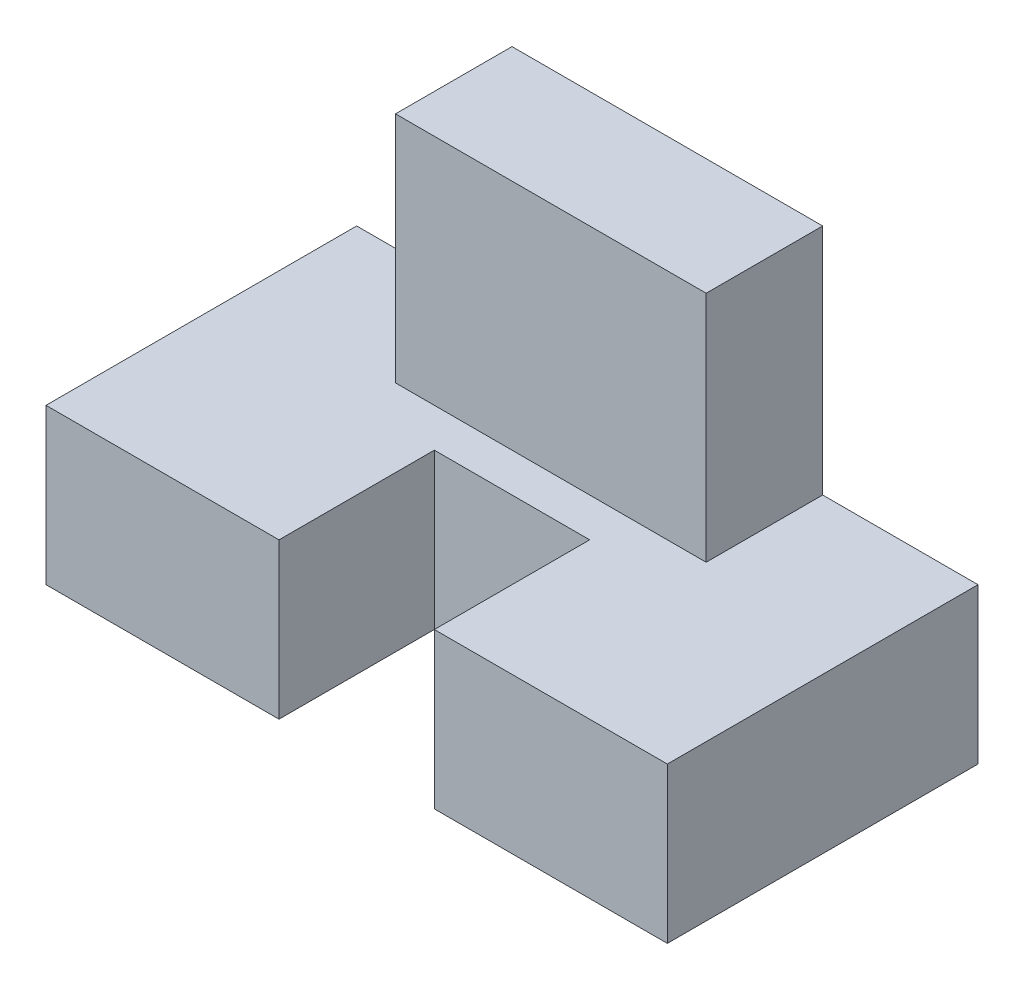
ISO-10303-21;
HEADER;
FILE_DESCRIPTION(('STEP AP214'),'2;1');
FILE_NAME('part.step','',(''),(''),'','','');
FILE_SCHEMA(('AUTOMOTIVE_DESIGN { 1 0 10303 214 1 1 1 1 }'));
ENDSEC;
DATA;
#1=APPLICATION_CONTEXT('core data for automotive mechanical design processes');
#2=APPLICATION_PROTOCOL_DEFINITION('international standard','automotive_design',2000,#1);
#3=PRODUCT_CONTEXT('',#1,'mechanical');
#4=PRODUCT('Part','Part','',(#3));
#5=PRODUCT_RELATED_PRODUCT_CATEGORY('part','',(#4));
#6=PRODUCT_DEFINITION_FORMATION('','',#4);
#7=PRODUCT_DEFINITION_CONTEXT('part definition',#1,'design');
#8=PRODUCT_DEFINITION('design','',#6,#7);
#9=PRODUCT_DEFINITION_SHAPE('','',#8);
#10=(LENGTH_UNIT() NAMED_UNIT(*) SI_UNIT(.MILLI.,.METRE.));
#11=(NAMED_UNIT(*) PLANE_ANGLE_UNIT() SI_UNIT($,.RADIAN.));
#12=(NAMED_UNIT(*) SI_UNIT($,.STERADIAN.) SOLID_ANGLE_UNIT());
#13=UNCERTAINTY_MEASURE_WITH_UNIT(LENGTH_MEASURE(1.E-05),#10,'distance_accuracy_value','');
#14=(GEOMETRIC_REPRESENTATION_CONTEXT(3) GLOBAL_UNCERTAINTY_ASSIGNED_CONTEXT((#13)) GLOBAL_UNIT_ASSIGNED_CONTEXT((#10,
#11,#12)) REPRESENTATION_CONTEXT('',''));
#15=CARTESIAN_POINT('',(0.,0.,0.));
#16=DIRECTION('',(0.,0.,1.));
#17=DIRECTION('',(1.,0.,0.));
#18=AXIS2_PLACEMENT_3D('',#15,#16,#17);
#19=CARTESIAN_POINT('',(0.,25.4,0.));
#20=DIRECTION('',(0.,-1.,0.));
#21=DIRECTION('',(0.,0.,-1.));
#22=AXIS2_PLACEMENT_3D('',#19,#20,#21);
#23=PLANE('',#22);
#24=DIRECTION('',(0.,0.,-1.));
#25=VECTOR('',#24,1.);
#26=CARTESIAN_POINT('',(76.2,25.4,-31.75));
#27=LINE('',#26,#25);
#28=CARTESIAN_POINT('',(76.2,25.4,-31.75));
#29=VERTEX_POINT('',#28);
#30=CARTESIAN_POINT('',(76.2,25.4,-50.8));
#31=VERTEX_POINT('',#30);
#32=EDGE_CURVE('E48',#29,#31,#27,.T.);
#33=ORIENTED_EDGE('',*,*,#32,.F.);
#34=DIRECTION('',(1.,0.,0.));
#35=VECTOR('',#34,1.);
#36=CARTESIAN_POINT('',(25.4,25.4,-31.75));
#37=LINE('',#36,#35);
#38=CARTESIAN_POINT('',(25.4,25.4,-31.75));
#39=VERTEX_POINT('',#38);
#40=EDGE_CURVE('E357',#39,#29,#37,.T.);
#41=ORIENTED_EDGE('',*,*,#40,.F.);
#42=DIRECTION('',(0.,0.,1.));
#43=VECTOR('',#42,1.);
#44=CARTESIAN_POINT('',(25.4,25.4,-50.8));
#45=LINE('',#44,#43);
#46=CARTESIAN_POINT('',(25.4,25.4,-50.8));
#47=VERTEX_POINT('',#46);
#48=EDGE_CURVE('E54',#47,#39,#45,.T.);
#49=ORIENTED_EDGE('',*,*,#48,.F.);
#50=DIRECTION('',(-1.,0.,0.));
#51=VECTOR('',#50,1.);
#52=CARTESIAN_POINT('',(0.,25.4,-50.8));
#53=LINE('',#52,#51);
#54=CARTESIAN_POINT('',(0.,25.4,-50.8));
#55=VERTEX_POINT('',#54);
#56=EDGE_CURVE('E143',#47,#55,#53,.T.);
#57=ORIENTED_EDGE('',*,*,#56,.T.);
#58=DIRECTION('',(0.,0.,1.));
#59=VECTOR('',#58,1.);
#60=CARTESIAN_POINT('',(0.,25.4,0.));
#61=LINE('',#60,#59);
#62=CARTESIAN_POINT('',(0.,25.4,0.));
#63=VERTEX_POINT('',#62);
#64=EDGE_CURVE('E153',#55,#63,#61,.T.);
#65=ORIENTED_EDGE('',*,*,#64,.T.);
#66=DIRECTION('',(1.,0.,0.));
#67=VECTOR('',#66,1.);
#68=CARTESIAN_POINT('',(0.,25.4,0.));
#69=LINE('',#68,#67);
#70=CARTESIAN_POINT('',(38.1,25.4,0.));
#71=VERTEX_POINT('',#70);
#72=EDGE_CURVE('E156',#63,#71,#69,.T.);
#73=ORIENTED_EDGE('',*,*,#72,.T.);
#74=DIRECTION('',(0.,0.,-1.));
#75=VECTOR('',#74,1.);
#76=CARTESIAN_POINT('',(38.1,25.4,0.));
#77=LINE('',#76,#75);
#78=CARTESIAN_POINT('',(38.1,25.4,-25.4));
#79=VERTEX_POINT('',#78);
#80=EDGE_CURVE('E159',#71,#79,#77,.T.);
#81=ORIENTED_EDGE('',*,*,#80,.T.);
#82=DIRECTION('',(1.,0.,0.));
#83=VECTOR('',#82,1.);
#84=CARTESIAN_POINT('',(38.1,25.4,-25.4));
#85=LINE('',#84,#83);
#86=CARTESIAN_POINT('',(63.5,25.4,-25.4));
#87=VERTEX_POINT('',#86);
#88=EDGE_CURVE('E161',#79,#87,#85,.T.);
#89=ORIENTED_EDGE('',*,*,#88,.T.);
#90=DIRECTION('',(0.,0.,1.));
#91=VECTOR('',#90,1.);
#92=CARTESIAN_POINT('',(63.5,25.4,-25.4));
#93=LINE('',#92,#91);
#94=CARTESIAN_POINT('',(63.5,25.4,0.));
#95=VERTEX_POINT('',#94);
#96=EDGE_CURVE('E163',#87,#95,#93,.T.);
#97=ORIENTED_EDGE('',*,*,#96,.T.);
#98=DIRECTION('',(1.,0.,0.));
#99=VECTOR('',#98,1.);
#100=CARTESIAN_POINT('',(63.5,25.4,0.));
#101=LINE('',#100,#99);
#102=CARTESIAN_POINT('',(101.6,25.4,0.));
#103=VERTEX_POINT('',#102);
#104=EDGE_CURVE('E165',#95,#103,#101,.T.);
#105=ORIENTED_EDGE('',*,*,#104,.T.);
#106=DIRECTION('',(0.,0.,-1.));
#107=VECTOR('',#106,1.);
#108=CARTESIAN_POINT('',(101.6,25.4,0.));
#109=LINE('',#108,#107);
#110=CARTESIAN_POINT('',(101.6,25.4,-50.8));
#111=VERTEX_POINT('',#110);
#112=EDGE_CURVE('E167',#103,#111,#109,.T.);
#113=ORIENTED_EDGE('',*,*,#112,.T.);
#114=EDGE_CURVE('E169',#111,#31,#53,.T.);
#115=ORIENTED_EDGE('',*,*,#114,.T.);
#116=EDGE_LOOP('',(#33,#41,#49,#57,#65,#73,#81,#89,#97,#105,#113,#115));
#117=FACE_BOUND('',#116,.T.);
#118=ADVANCED_FACE('F33',(#117),#23,.F.);
#119=CARTESIAN_POINT('',(0.,25.4,0.));
#120=DIRECTION('',(1.,0.,0.));
#121=DIRECTION('',(0.,0.,-1.));
#122=AXIS2_PLACEMENT_3D('',#119,#120,#121);
#123=PLANE('',#122);
#124=DIRECTION('',(0.,0.,1.));
#125=VECTOR('',#124,1.);
#126=CARTESIAN_POINT('',(0.,0.,0.));
#127=LINE('',#126,#125);
#128=CARTESIAN_POINT('',(0.,0.,-50.8));
#129=VERTEX_POINT('',#128);
#130=CARTESIAN_POINT('',(0.,0.,0.));
#131=VERTEX_POINT('',#130);
#132=EDGE_CURVE('E144',#129,#131,#127,.T.);
#133=ORIENTED_EDGE('',*,*,#132,.T.);
#134=DIRECTION('',(0.,-1.,0.));
#135=VECTOR('',#134,1.);
#136=CARTESIAN_POINT('',(0.,25.4,0.));
#137=LINE('',#136,#135);
#138=EDGE_CURVE('E11',#63,#131,#137,.T.);
#139=ORIENTED_EDGE('',*,*,#138,.F.);
#140=ORIENTED_EDGE('',*,*,#64,.F.);
#141=DIRECTION('',(0.,-1.,0.));
#142=VECTOR('',#141,1.);
#143=CARTESIAN_POINT('',(0.,25.4,-50.8));
#144=LINE('',#143,#142);
#145=EDGE_CURVE('E170',#55,#129,#144,.T.);
#146=ORIENTED_EDGE('',*,*,#145,.T.);
#147=EDGE_LOOP('',(#133,#139,#140,#146));
#148=FACE_BOUND('',#147,.T.);
#149=ADVANCED_FACE('F35',(#148),#123,.F.);
#150=CARTESIAN_POINT('',(0.,25.4,0.));
#151=DIRECTION('',(0.,0.,-1.));
#152=DIRECTION('',(-1.,0.,0.));
#153=AXIS2_PLACEMENT_3D('',#150,#151,#152);
#154=PLANE('',#153);
#155=DIRECTION('',(1.,0.,0.));
#156=VECTOR('',#155,1.);
#157=CARTESIAN_POINT('',(0.,0.,0.));
#158=LINE('',#157,#156);
#159=CARTESIAN_POINT('',(38.1,0.,0.));
#160=VERTEX_POINT('',#159);
#161=EDGE_CURVE('E147',#131,#160,#158,.T.);
#162=ORIENTED_EDGE('',*,*,#161,.T.);
#163=DIRECTION('',(0.,-1.,0.));
#164=VECTOR('',#163,1.);
#165=CARTESIAN_POINT('',(38.1,25.4,0.));
#166=LINE('',#165,#164);
#167=EDGE_CURVE('E41',#71,#160,#166,.T.);
#168=ORIENTED_EDGE('',*,*,#167,.F.);
#169=ORIENTED_EDGE('',*,*,#72,.F.);
#170=ORIENTED_EDGE('',*,*,#138,.T.);
#171=EDGE_LOOP('',(#162,#168,#169,#170));
#172=FACE_BOUND('',#171,.T.);
#173=ADVANCED_FACE('F226',(#172),#154,.F.);
#174=CARTESIAN_POINT('',(38.1,25.4,0.));
#175=DIRECTION('',(-1.,0.,0.));
#176=DIRECTION('',(0.,0.,1.));
#177=AXIS2_PLACEMENT_3D('',#174,#175,#176);
#178=PLANE('',#177);
#179=DIRECTION('',(0.,0.,-1.));
#180=VECTOR('',#179,1.);
#181=CARTESIAN_POINT('',(38.1,0.,0.));
#182=LINE('',#181,#180);
#183=CARTESIAN_POINT('',(38.1,0.,-25.4));
#184=VERTEX_POINT('',#183);
#185=EDGE_CURVE('E173',#160,#184,#182,.T.);
#186=ORIENTED_EDGE('',*,*,#185,.T.);
#187=DIRECTION('',(0.,-1.,0.));
#188=VECTOR('',#187,1.);
#189=CARTESIAN_POINT('',(38.1,25.4,-25.4));
#190=LINE('',#189,#188);
#191=EDGE_CURVE('E198',#79,#184,#190,.T.);
#192=ORIENTED_EDGE('',*,*,#191,.F.);
#193=ORIENTED_EDGE('',*,*,#80,.F.);
#194=ORIENTED_EDGE('',*,*,#167,.T.);
#195=EDGE_LOOP('',(#186,#192,#193,#194));
#196=FACE_BOUND('',#195,.T.);
#197=ADVANCED_FACE('F205',(#196),#178,.F.);
#198=CARTESIAN_POINT('',(38.1,25.4,-25.4));
#199=DIRECTION('',(0.,0.,-1.));
#200=DIRECTION('',(-1.,0.,0.));
#201=AXIS2_PLACEMENT_3D('',#198,#199,#200);
#202=PLANE('',#201);
#203=DIRECTION('',(1.,0.,0.));
#204=VECTOR('',#203,1.);
#205=CARTESIAN_POINT('',(38.1,0.,-25.4));
#206=LINE('',#205,#204);
#207=CARTESIAN_POINT('',(63.5,0.,-25.4));
#208=VERTEX_POINT('',#207);
#209=EDGE_CURVE('E175',#184,#208,#206,.T.);
#210=ORIENTED_EDGE('',*,*,#209,.T.);
#211=DIRECTION('',(0.,-1.,0.));
#212=VECTOR('',#211,1.);
#213=CARTESIAN_POINT('',(63.5,25.4,-25.4));
#214=LINE('',#213,#212);
#215=EDGE_CURVE('E195',#87,#208,#214,.T.);
#216=ORIENTED_EDGE('',*,*,#215,.F.);
#217=ORIENTED_EDGE('',*,*,#88,.F.);
#218=ORIENTED_EDGE('',*,*,#191,.T.);
#219=EDGE_LOOP('',(#210,#216,#217,#218));
#220=FACE_BOUND('',#219,.T.);
#221=ADVANCED_FACE('F216',(#220),#202,.F.);
#222=CARTESIAN_POINT('',(63.5,25.4,-25.4));
#223=DIRECTION('',(1.,0.,0.));
#224=DIRECTION('',(0.,0.,-1.));
#225=AXIS2_PLACEMENT_3D('',#222,#223,#224);
#226=PLANE('',#225);
#227=DIRECTION('',(0.,0.,1.));
#228=VECTOR('',#227,1.);
#229=CARTESIAN_POINT('',(63.5,0.,-25.4));
#230=LINE('',#229,#228);
#231=CARTESIAN_POINT('',(63.5,0.,0.));
#232=VERTEX_POINT('',#231);
#233=EDGE_CURVE('E177',#208,#232,#230,.T.);
#234=ORIENTED_EDGE('',*,*,#233,.T.);
#235=DIRECTION('',(0.,-1.,0.));
#236=VECTOR('',#235,1.);
#237=CARTESIAN_POINT('',(63.5,25.4,0.));
#238=LINE('',#237,#236);
#239=EDGE_CURVE('E192',#95,#232,#238,.T.);
#240=ORIENTED_EDGE('',*,*,#239,.F.);
#241=ORIENTED_EDGE('',*,*,#96,.F.);
#242=ORIENTED_EDGE('',*,*,#215,.T.);
#243=EDGE_LOOP('',(#234,#240,#241,#242));
#244=FACE_BOUND('',#243,.T.);
#245=ADVANCED_FACE('F220',(#244),#226,.F.);
#246=CARTESIAN_POINT('',(63.5,25.4,0.));
#247=DIRECTION('',(0.,0.,-1.));
#248=DIRECTION('',(-1.,0.,0.));
#249=AXIS2_PLACEMENT_3D('',#246,#247,#248);
#250=PLANE('',#249);
#251=DIRECTION('',(1.,0.,0.));
#252=VECTOR('',#251,1.);
#253=CARTESIAN_POINT('',(63.5,0.,0.));
#254=LINE('',#253,#252);
#255=CARTESIAN_POINT('',(101.6,0.,0.));
#256=VERTEX_POINT('',#255);
#257=EDGE_CURVE('E179',#232,#256,#254,.T.);
#258=ORIENTED_EDGE('',*,*,#257,.T.);
#259=DIRECTION('',(0.,-1.,0.));
#260=VECTOR('',#259,1.);
#261=CARTESIAN_POINT('',(101.6,25.4,0.));
#262=LINE('',#261,#260);
#263=EDGE_CURVE('E189',#103,#256,#262,.T.);
#264=ORIENTED_EDGE('',*,*,#263,.F.);
#265=ORIENTED_EDGE('',*,*,#104,.F.);
#266=ORIENTED_EDGE('',*,*,#239,.T.);
#267=EDGE_LOOP('',(#258,#264,#265,#266));
#268=FACE_BOUND('',#267,.T.);
#269=ADVANCED_FACE('F236',(#268),#250,.F.);
#270=CARTESIAN_POINT('',(101.6,25.4,0.));
#271=DIRECTION('',(-1.,0.,0.));
#272=DIRECTION('',(0.,0.,1.));
#273=AXIS2_PLACEMENT_3D('',#270,#271,#272);
#274=PLANE('',#273);
#275=DIRECTION('',(0.,0.,-1.));
#276=VECTOR('',#275,1.);
#277=CARTESIAN_POINT('',(101.6,0.,0.));
#278=LINE('',#277,#276);
#279=CARTESIAN_POINT('',(101.6,0.,-50.8));
#280=VERTEX_POINT('',#279);
#281=EDGE_CURVE('E181',#256,#280,#278,.T.);
#282=ORIENTED_EDGE('',*,*,#281,.T.);
#283=DIRECTION('',(0.,-1.,0.));
#284=VECTOR('',#283,1.);
#285=CARTESIAN_POINT('',(101.6,25.4,-50.8));
#286=LINE('',#285,#284);
#287=EDGE_CURVE('E186',#111,#280,#286,.T.);
#288=ORIENTED_EDGE('',*,*,#287,.F.);
#289=ORIENTED_EDGE('',*,*,#112,.F.);
#290=ORIENTED_EDGE('',*,*,#263,.T.);
#291=EDGE_LOOP('',(#282,#288,#289,#290));
#292=FACE_BOUND('',#291,.T.);
#293=ADVANCED_FACE('F234',(#292),#274,.F.);
#294=CARTESIAN_POINT('',(0.,25.4,-50.8));
#295=DIRECTION('',(0.,0.,1.));
#296=DIRECTION('',(1.,0.,0.));
#297=AXIS2_PLACEMENT_3D('',#294,#295,#296);
#298=PLANE('',#297);
#299=DIRECTION('',(-1.,0.,0.));
#300=VECTOR('',#299,1.);
#301=CARTESIAN_POINT('',(0.,0.,-50.8));
#302=LINE('',#301,#300);
#303=EDGE_CURVE('E157',#280,#129,#302,.T.);
#304=ORIENTED_EDGE('',*,*,#303,.T.);
#305=ORIENTED_EDGE('',*,*,#145,.F.);
#306=ORIENTED_EDGE('',*,*,#56,.F.);
#307=DIRECTION('',(0.,-1.,0.));
#308=VECTOR('',#307,1.);
#309=CARTESIAN_POINT('',(25.4,63.5,-50.8));
#310=LINE('',#309,#308);
#311=CARTESIAN_POINT('',(25.4,63.5,-50.8));
#312=VERTEX_POINT('',#311);
#313=EDGE_CURVE('E125',#312,#47,#310,.T.);
#314=ORIENTED_EDGE('',*,*,#313,.F.);
#315=DIRECTION('',(-1.,0.,0.));
#316=VECTOR('',#315,1.);
#317=CARTESIAN_POINT('',(76.2,63.5,-50.8));
#318=LINE('',#317,#316);
#319=CARTESIAN_POINT('',(76.2,63.5,-50.8));
#320=VERTEX_POINT('',#319);
#321=EDGE_CURVE('E131',#320,#312,#318,.T.);
#322=ORIENTED_EDGE('',*,*,#321,.F.);
#323=DIRECTION('',(0.,-1.,0.));
#324=VECTOR('',#323,1.);
#325=CARTESIAN_POINT('',(76.2,63.5,-50.8));
#326=LINE('',#325,#324);
#327=EDGE_CURVE('E355',#320,#31,#326,.T.);
#328=ORIENTED_EDGE('',*,*,#327,.T.);
#329=ORIENTED_EDGE('',*,*,#114,.F.);
#330=ORIENTED_EDGE('',*,*,#287,.T.);
#331=EDGE_LOOP('',(#304,#305,#306,#314,#322,#328,#329,#330));
#332=FACE_BOUND('',#331,.T.);
#333=ADVANCED_FACE('F141',(#332),#298,.F.);
#334=CARTESIAN_POINT('',(0.,0.,0.));
#335=DIRECTION('',(0.,-1.,0.));
#336=DIRECTION('',(0.,0.,-1.));
#337=AXIS2_PLACEMENT_3D('',#334,#335,#336);
#338=PLANE('',#337);
#339=ORIENTED_EDGE('',*,*,#132,.F.);
#340=ORIENTED_EDGE('',*,*,#303,.F.);
#341=ORIENTED_EDGE('',*,*,#281,.F.);
#342=ORIENTED_EDGE('',*,*,#257,.F.);
#343=ORIENTED_EDGE('',*,*,#233,.F.);
#344=ORIENTED_EDGE('',*,*,#209,.F.);
#345=ORIENTED_EDGE('',*,*,#185,.F.);
#346=ORIENTED_EDGE('',*,*,#161,.F.);
#347=EDGE_LOOP('',(#339,#340,#341,#342,#343,#344,#345,#346));
#348=FACE_BOUND('',#347,.T.);
#349=ADVANCED_FACE('F211',(#348),#338,.T.);
#350=CARTESIAN_POINT('',(25.4,63.5,-50.8));
#351=DIRECTION('',(1.,0.,0.));
#352=DIRECTION('',(0.,0.,-1.));
#353=AXIS2_PLACEMENT_3D('',#350,#351,#352);
#354=PLANE('',#353);
#355=ORIENTED_EDGE('',*,*,#48,.T.);
#356=DIRECTION('',(0.,-1.,0.));
#357=VECTOR('',#356,1.);
#358=CARTESIAN_POINT('',(25.4,63.5,-31.75));
#359=LINE('',#358,#357);
#360=CARTESIAN_POINT('',(25.4,63.5,-31.75));
#361=VERTEX_POINT('',#360);
#362=EDGE_CURVE('E127',#361,#39,#359,.T.);
#363=ORIENTED_EDGE('',*,*,#362,.F.);
#364=DIRECTION('',(0.,0.,1.));
#365=VECTOR('',#364,1.);
#366=CARTESIAN_POINT('',(25.4,63.5,-50.8));
#367=LINE('',#366,#365);
#368=EDGE_CURVE('E121',#312,#361,#367,.T.);
#369=ORIENTED_EDGE('',*,*,#368,.F.);
#370=ORIENTED_EDGE('',*,*,#313,.T.);
#371=EDGE_LOOP('',(#355,#363,#369,#370));
#372=FACE_BOUND('',#371,.T.);
#373=ADVANCED_FACE('F123',(#372),#354,.F.);
#374=CARTESIAN_POINT('',(25.4,63.5,-31.75));
#375=DIRECTION('',(0.,0.,-1.));
#376=DIRECTION('',(-1.,0.,0.));
#377=AXIS2_PLACEMENT_3D('',#374,#375,#376);
#378=PLANE('',#377);
#379=ORIENTED_EDGE('',*,*,#40,.T.);
#380=DIRECTION('',(0.,-1.,0.));
#381=VECTOR('',#380,1.);
#382=CARTESIAN_POINT('',(76.2,63.5,-31.75));
#383=LINE('',#382,#381);
#384=CARTESIAN_POINT('',(76.2,63.5,-31.75));
#385=VERTEX_POINT('',#384);
#386=EDGE_CURVE('E149',#385,#29,#383,.T.);
#387=ORIENTED_EDGE('',*,*,#386,.F.);
#388=DIRECTION('',(1.,0.,0.));
#389=VECTOR('',#388,1.);
#390=CARTESIAN_POINT('',(25.4,63.5,-31.75));
#391=LINE('',#390,#389);
#392=EDGE_CURVE('E130',#361,#385,#391,.T.);
#393=ORIENTED_EDGE('',*,*,#392,.F.);
#394=ORIENTED_EDGE('',*,*,#362,.T.);
#395=EDGE_LOOP('',(#379,#387,#393,#394));
#396=FACE_BOUND('',#395,.T.);
#397=ADVANCED_FACE('F270',(#396),#378,.F.);
#398=CARTESIAN_POINT('',(76.2,63.5,-31.75));
#399=DIRECTION('',(-1.,0.,0.));
#400=DIRECTION('',(0.,0.,1.));
#401=AXIS2_PLACEMENT_3D('',#398,#399,#400);
#402=PLANE('',#401);
#403=ORIENTED_EDGE('',*,*,#32,.T.);
#404=ORIENTED_EDGE('',*,*,#327,.F.);
#405=DIRECTION('',(0.,0.,-1.));
#406=VECTOR('',#405,1.);
#407=CARTESIAN_POINT('',(76.2,63.5,-31.75));
#408=LINE('',#407,#406);
#409=EDGE_CURVE('E136',#385,#320,#408,.T.);
#410=ORIENTED_EDGE('',*,*,#409,.F.);
#411=ORIENTED_EDGE('',*,*,#386,.T.);
#412=EDGE_LOOP('',(#403,#404,#410,#411));
#413=FACE_BOUND('',#412,.T.);
#414=ADVANCED_FACE('F276',(#413),#402,.F.);
#415=CARTESIAN_POINT('',(0.,63.5,0.));
#416=DIRECTION('',(0.,1.,0.));
#417=DIRECTION('',(0.,0.,1.));
#418=AXIS2_PLACEMENT_3D('',#415,#416,#417);
#419=PLANE('',#418);
#420=ORIENTED_EDGE('',*,*,#321,.T.);
#421=ORIENTED_EDGE('',*,*,#368,.T.);
#422=ORIENTED_EDGE('',*,*,#392,.T.);
#423=ORIENTED_EDGE('',*,*,#409,.T.);
#424=EDGE_LOOP('',(#420,#421,#422,#423));
#425=FACE_BOUND('',#424,.T.);
#426=ADVANCED_FACE('F134',(#425),#419,.T.);
#427=CLOSED_SHELL('',(#118,#149,#173,#197,#221,#245,#269,#293,#333,#349,#373,#397,#414,#426));
#428=MANIFOLD_SOLID_BREP('B2',#427);
#429=ADVANCED_BREP_SHAPE_REPRESENTATION('',(#18,#428),#14);
#430=SHAPE_DEFINITION_REPRESENTATION(#9,#429);
ENDSEC;
END-ISO-10303-21;
